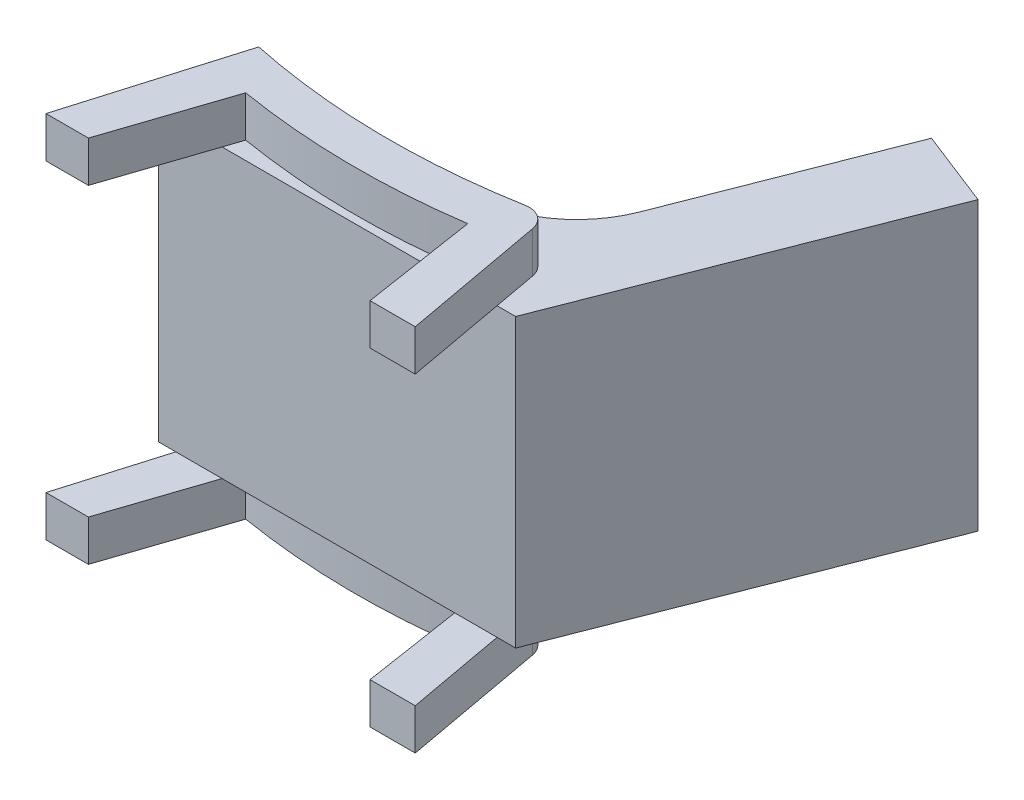
ISO-10303-21;
HEADER;
FILE_DESCRIPTION(('STEP AP214'),'2;1');
FILE_NAME('part.step','',(''),(''),'','','');
FILE_SCHEMA(('AUTOMOTIVE_DESIGN { 1 0 10303 214 1 1 1 1 }'));
ENDSEC;
DATA;
#1=APPLICATION_CONTEXT('core data for automotive mechanical design processes');
#2=APPLICATION_PROTOCOL_DEFINITION('international standard','automotive_design',2000,#1);
#3=PRODUCT_CONTEXT('',#1,'mechanical');
#4=PRODUCT('Part','Part','',(#3));
#5=PRODUCT_RELATED_PRODUCT_CATEGORY('part','',(#4));
#6=PRODUCT_DEFINITION_FORMATION('','',#4);
#7=PRODUCT_DEFINITION_CONTEXT('part definition',#1,'design');
#8=PRODUCT_DEFINITION('design','',#6,#7);
#9=PRODUCT_DEFINITION_SHAPE('','',#8);
#10=(LENGTH_UNIT() NAMED_UNIT(*) SI_UNIT(.MILLI.,.METRE.));
#11=(NAMED_UNIT(*) PLANE_ANGLE_UNIT() SI_UNIT($,.RADIAN.));
#12=(NAMED_UNIT(*) SI_UNIT($,.STERADIAN.) SOLID_ANGLE_UNIT());
#13=UNCERTAINTY_MEASURE_WITH_UNIT(LENGTH_MEASURE(1.E-05),#10,'distance_accuracy_value','');
#14=(GEOMETRIC_REPRESENTATION_CONTEXT(3) GLOBAL_UNCERTAINTY_ASSIGNED_CONTEXT((#13)) GLOBAL_UNIT_ASSIGNED_CONTEXT((#10,
#11,#12)) REPRESENTATION_CONTEXT('',''));
#15=CARTESIAN_POINT('',(0.,0.,0.));
#16=DIRECTION('',(0.,0.,1.));
#17=DIRECTION('',(1.,0.,0.));
#18=AXIS2_PLACEMENT_3D('',#15,#16,#17);
#19=CARTESIAN_POINT('',(0.,0.,0.));
#20=DIRECTION('',(0.,1.,0.));
#21=DIRECTION('',(0.,0.,1.));
#22=AXIS2_PLACEMENT_3D('',#19,#20,#21);
#23=PLANE('',#22);
#24=DIRECTION('',(1.,0.,0.));
#25=VECTOR('',#24,1.);
#26=CARTESIAN_POINT('',(0.,0.,0.));
#27=LINE('',#26,#25);
#28=CARTESIAN_POINT('',(-46.0589342714721,0.,0.));
#29=VERTEX_POINT('',#28);
#30=CARTESIAN_POINT('',(10.6458555513355,0.,0.));
#31=VERTEX_POINT('',#30);
#32=EDGE_CURVE('E570',#29,#31,#27,.T.);
#33=ORIENTED_EDGE('',*,*,#32,.F.);
#34=DIRECTION('',(0.317535573217224,0.,-0.948246360257507));
#35=VECTOR('',#34,1.);
#36=CARTESIAN_POINT('',(-44.613683260958,0.,-4.31590702261566));
#37=LINE('',#36,#35);
#38=CARTESIAN_POINT('',(-44.613683260958,0.,-4.31590702261566));
#39=VERTEX_POINT('',#38);
#40=EDGE_CURVE('E315',#29,#39,#37,.T.);
#41=ORIENTED_EDGE('',*,*,#40,.T.);
#42=CARTESIAN_POINT('',(-15.4614294836007,0.,-180.10475201362));
#43=DIRECTION('',(0.,1.,0.));
#44=DIRECTION('',(0.,0.,1.));
#45=AXIS2_PLACEMENT_3D('',#42,#43,#44);
#46=CIRCLE('',#45,178.189707681367);
#47=CARTESIAN_POINT('',(10.0657857926259,0.,-3.75302051145421));
#48=VERTEX_POINT('',#47);
#49=EDGE_CURVE('E308',#39,#48,#46,.T.);
#50=ORIENTED_EDGE('',*,*,#49,.T.);
#51=DIRECTION('',(0.152747053337756,0.,0.988265317461173));
#52=VECTOR('',#51,1.);
#53=CARTESIAN_POINT('',(10.0657857926259,0.,-3.75302051145418));
#54=LINE('',#53,#52);
#55=EDGE_CURVE('E304',#48,#31,#54,.T.);
#56=ORIENTED_EDGE('',*,*,#55,.T.);
#57=EDGE_LOOP('',(#33,#41,#50,#56));
#58=FACE_BOUND('',#57,.T.);
#59=ADVANCED_FACE('F41',(#58),#23,.F.);
#60=CARTESIAN_POINT('',(0.,70.,0.));
#61=DIRECTION('',(0.,1.,0.));
#62=DIRECTION('',(0.,0.,1.));
#63=AXIS2_PLACEMENT_3D('',#60,#61,#62);
#64=PLANE('',#63);
#65=DIRECTION('',(-0.284095010499683,0.,0.95879613318431));
#66=VECTOR('',#65,1.);
#67=CARTESIAN_POINT('',(-52.712841502614,70.,-15.5886534019939));
#68=LINE('',#67,#66);
#69=CARTESIAN_POINT('',(-52.7128415026139,70.,-15.5886534019939));
#70=VERTEX_POINT('',#69);
#71=CARTESIAN_POINT('',(-57.3318199263244,70.,0.));
#72=VERTEX_POINT('',#71);
#73=EDGE_CURVE('E338',#70,#72,#68,.T.);
#74=ORIENTED_EDGE('',*,*,#73,.F.);
#75=CARTESIAN_POINT('',(-17.2956694732917,70.,-184.924485184418));
#76=DIRECTION('',(0.,-1.,0.));
#77=DIRECTION('',(0.,0.,1.));
#78=AXIS2_PLACEMENT_3D('',#75,#76,#77);
#79=CIRCLE('',#78,173.);
#80=CARTESIAN_POINT('',(13.2298747218645,70.,-14.6388687877604));
#81=VERTEX_POINT('',#80);
#82=EDGE_CURVE('E385',#81,#70,#79,.T.);
#83=ORIENTED_EDGE('',*,*,#82,.F.);
#84=CARTESIAN_POINT('',(14.1121158835742,70.,-9.71731918092061));
#85=DIRECTION('',(0.,1.,0.));
#86=DIRECTION('',(0.,0.,1.));
#87=AXIS2_PLACEMENT_3D('',#84,#85,#86);
#88=CIRCLE('',#87,5.);
#89=CARTESIAN_POINT('',(19.0305806480095,70.,-10.6165990934108));
#90=VERTEX_POINT('',#89);
#91=EDGE_CURVE('E509',#81,#90,#88,.F.);
#92=ORIENTED_EDGE('',*,*,#91,.T.);
#93=DIRECTION('',(-0.179855982498028,0.,-0.983692952887063));
#94=VECTOR('',#93,1.);
#95=CARTESIAN_POINT('',(18.1215025560305,70.,-15.5886534019939));
#96=LINE('',#95,#94);
#97=CARTESIAN_POINT('',(20.9716933246114,70.,0.));
#98=VERTEX_POINT('',#97);
#99=EDGE_CURVE('E386',#98,#90,#96,.T.);
#100=ORIENTED_EDGE('',*,*,#99,.F.);
#101=DIRECTION('',(1.,0.,0.));
#102=VECTOR('',#101,1.);
#103=CARTESIAN_POINT('',(0.,70.,0.));
#104=LINE('',#103,#102);
#105=CARTESIAN_POINT('',(25.4998700607755,70.,0.));
#106=VERTEX_POINT('',#105);
#107=EDGE_CURVE('E437',#98,#106,#104,.T.);
#108=ORIENTED_EDGE('',*,*,#107,.T.);
#109=DIRECTION('',(0.364080080432998,0.,-0.931367647619296));
#110=VECTOR('',#109,1.);
#111=CARTESIAN_POINT('',(22.1197525080925,70.,8.64681234407255));
#112=LINE('',#111,#110);
#113=CARTESIAN_POINT('',(57.1748370584463,70.,-81.0289853428788));
#114=VERTEX_POINT('',#113);
#115=EDGE_CURVE('E442',#106,#114,#112,.T.);
#116=ORIENTED_EDGE('',*,*,#115,.T.);
#117=DIRECTION('',(-0.931367647619296,0.,-0.364080080432998));
#118=VECTOR('',#117,1.);
#119=CARTESIAN_POINT('',(35.0550845503538,70.,-89.6757976869513));
#120=LINE('',#119,#118);
#121=CARTESIAN_POINT('',(38.5474841060604,70.,-88.3105869515387));
#122=VERTEX_POINT('',#121);
#123=EDGE_CURVE('E446',#114,#122,#120,.T.);
#124=ORIENTED_EDGE('',*,*,#123,.T.);
#125=DIRECTION('',(0.364080080432998,0.,-0.931367647619296));
#126=VECTOR('',#125,1.);
#127=CARTESIAN_POINT('',(3.4923995557066,70.,1.36521073541258));
#128=LINE('',#127,#126);
#129=CARTESIAN_POINT('',(18.5561003578887,70.,-37.1698378283091));
#130=VERTEX_POINT('',#129);
#131=EDGE_CURVE('E421',#130,#122,#128,.T.);
#132=ORIENTED_EDGE('',*,*,#131,.F.);
#133=CARTESIAN_POINT('',(-6.59082612783227,70.,-47.));
#134=DIRECTION('',(0.,1.,0.));
#135=DIRECTION('',(0.,0.,1.));
#136=AXIS2_PLACEMENT_3D('',#133,#134,#135);
#137=CIRCLE('',#136,27.);
#138=CARTESIAN_POINT('',(-6.59082612783227,70.,-20.));
#139=VERTEX_POINT('',#138);
#140=EDGE_CURVE('E425',#130,#139,#137,.F.);
#141=ORIENTED_EDGE('',*,*,#140,.T.);
#142=DIRECTION('',(1.,0.,0.));
#143=VECTOR('',#142,1.);
#144=CARTESIAN_POINT('',(0.,70.,-20.));
#145=LINE('',#144,#143);
#146=CARTESIAN_POINT('',(-61.5001299392245,70.,-20.));
#147=VERTEX_POINT('',#146);
#148=EDGE_CURVE('E429',#147,#139,#145,.T.);
#149=ORIENTED_EDGE('',*,*,#148,.F.);
#150=DIRECTION('',(0.,0.,-1.));
#151=VECTOR('',#150,1.);
#152=CARTESIAN_POINT('',(-61.5001299392245,70.,0.));
#153=LINE('',#152,#151);
#154=CARTESIAN_POINT('',(-61.5001299392245,70.,0.));
#155=VERTEX_POINT('',#154);
#156=EDGE_CURVE('E433',#155,#147,#153,.T.);
#157=ORIENTED_EDGE('',*,*,#156,.F.);
#158=EDGE_CURVE('E438',#155,#72,#104,.T.);
#159=ORIENTED_EDGE('',*,*,#158,.T.);
#160=EDGE_LOOP('',(#74,#83,#92,#100,#108,#116,#124,#132,#141,#149,#157,#159));
#161=FACE_BOUND('',#160,.T.);
#162=ADVANCED_FACE('F535',(#161),#64,.T.);
#163=CARTESIAN_POINT('',(3.4923995557066,70.,1.36521073541258));
#164=DIRECTION('',(-0.931367647619296,0.,-0.364080080432998));
#165=DIRECTION('',(-0.364080080432998,0.,0.931367647619296));
#166=AXIS2_PLACEMENT_3D('',#163,#164,#165);
#167=PLANE('',#166);
#168=DIRECTION('',(0.364080080432998,0.,-0.931367647619296));
#169=VECTOR('',#168,1.);
#170=CARTESIAN_POINT('',(3.4923995557066,0.,1.36521073541258));
#171=LINE('',#170,#169);
#172=CARTESIAN_POINT('',(18.5561003578887,0.,-37.1698378283091));
#173=VERTEX_POINT('',#172);
#174=CARTESIAN_POINT('',(38.5474841060604,0.,-88.3105869515387));
#175=VERTEX_POINT('',#174);
#176=EDGE_CURVE('E420',#173,#175,#171,.T.);
#177=ORIENTED_EDGE('',*,*,#176,.F.);
#178=DIRECTION('',(0.,-1.,0.));
#179=VECTOR('',#178,1.);
#180=CARTESIAN_POINT('',(18.5561003578887,70.,-37.1698378283091));
#181=LINE('',#180,#179);
#182=EDGE_CURVE('E496',#130,#173,#181,.T.);
#183=ORIENTED_EDGE('',*,*,#182,.F.);
#184=ORIENTED_EDGE('',*,*,#131,.T.);
#185=DIRECTION('',(0.,-1.,0.));
#186=VECTOR('',#185,1.);
#187=CARTESIAN_POINT('',(38.5474841060604,70.,-88.3105869515387));
#188=LINE('',#187,#186);
#189=EDGE_CURVE('E449',#122,#175,#188,.T.);
#190=ORIENTED_EDGE('',*,*,#189,.T.);
#191=EDGE_LOOP('',(#177,#183,#184,#190));
#192=FACE_BOUND('',#191,.T.);
#193=ADVANCED_FACE('F542',(#192),#167,.T.);
#194=CARTESIAN_POINT('',(-6.59082612783227,70.,-47.));
#195=DIRECTION('',(0.,-1.,0.));
#196=DIRECTION('',(0.,0.,-1.));
#197=AXIS2_PLACEMENT_3D('',#194,#195,#196);
#198=CYLINDRICAL_SURFACE('',#197,27.);
#199=CARTESIAN_POINT('',(-6.59082612783227,0.,-47.));
#200=DIRECTION('',(0.,1.,0.));
#201=DIRECTION('',(0.,0.,1.));
#202=AXIS2_PLACEMENT_3D('',#199,#200,#201);
#203=CIRCLE('',#202,27.);
#204=CARTESIAN_POINT('',(-6.59082612783227,0.,-20.));
#205=VERTEX_POINT('',#204);
#206=EDGE_CURVE('E453',#173,#205,#203,.F.);
#207=ORIENTED_EDGE('',*,*,#206,.T.);
#208=DIRECTION('',(0.,-1.,0.));
#209=VECTOR('',#208,1.);
#210=CARTESIAN_POINT('',(-6.59082612783227,70.,-20.));
#211=LINE('',#210,#209);
#212=EDGE_CURVE('E493',#139,#205,#211,.T.);
#213=ORIENTED_EDGE('',*,*,#212,.F.);
#214=ORIENTED_EDGE('',*,*,#140,.F.);
#215=ORIENTED_EDGE('',*,*,#182,.T.);
#216=EDGE_LOOP('',(#207,#213,#214,#215));
#217=FACE_BOUND('',#216,.T.);
#218=ADVANCED_FACE('F713',(#217),#198,.F.);
#219=CARTESIAN_POINT('',(0.,70.,-20.));
#220=DIRECTION('',(0.,0.,-1.));
#221=DIRECTION('',(-1.,0.,0.));
#222=AXIS2_PLACEMENT_3D('',#219,#220,#221);
#223=PLANE('',#222);
#224=DIRECTION('',(1.,0.,0.));
#225=VECTOR('',#224,1.);
#226=CARTESIAN_POINT('',(0.,0.,-20.));
#227=LINE('',#226,#225);
#228=CARTESIAN_POINT('',(-61.5001299392245,0.,-20.));
#229=VERTEX_POINT('',#228);
#230=EDGE_CURVE('E457',#229,#205,#227,.T.);
#231=ORIENTED_EDGE('',*,*,#230,.F.);
#232=DIRECTION('',(0.,-1.,0.));
#233=VECTOR('',#232,1.);
#234=CARTESIAN_POINT('',(-61.5001299392245,70.,-20.));
#235=LINE('',#234,#233);
#236=EDGE_CURVE('E490',#147,#229,#235,.T.);
#237=ORIENTED_EDGE('',*,*,#236,.F.);
#238=ORIENTED_EDGE('',*,*,#148,.T.);
#239=ORIENTED_EDGE('',*,*,#212,.T.);
#240=EDGE_LOOP('',(#231,#237,#238,#239));
#241=FACE_BOUND('',#240,.T.);
#242=ADVANCED_FACE('F716',(#241),#223,.T.);
#243=CARTESIAN_POINT('',(-61.5001299392245,70.,0.));
#244=DIRECTION('',(-1.,0.,0.));
#245=DIRECTION('',(0.,0.,1.));
#246=AXIS2_PLACEMENT_3D('',#243,#244,#245);
#247=PLANE('',#246);
#248=DIRECTION('',(0.,0.,-1.));
#249=VECTOR('',#248,1.);
#250=CARTESIAN_POINT('',(-61.5001299392245,0.,0.));
#251=LINE('',#250,#249);
#252=CARTESIAN_POINT('',(-61.5001299392245,0.,0.));
#253=VERTEX_POINT('',#252);
#254=EDGE_CURVE('E461',#253,#229,#251,.T.);
#255=ORIENTED_EDGE('',*,*,#254,.F.);
#256=DIRECTION('',(0.,-1.,0.));
#257=VECTOR('',#256,1.);
#258=CARTESIAN_POINT('',(-61.5001299392245,70.,0.));
#259=LINE('',#258,#257);
#260=EDGE_CURVE('E487',#155,#253,#259,.T.);
#261=ORIENTED_EDGE('',*,*,#260,.F.);
#262=ORIENTED_EDGE('',*,*,#156,.T.);
#263=ORIENTED_EDGE('',*,*,#236,.T.);
#264=EDGE_LOOP('',(#255,#261,#262,#263));
#265=FACE_BOUND('',#264,.T.);
#266=ADVANCED_FACE('F718',(#265),#247,.T.);
#267=CARTESIAN_POINT('',(0.,70.,0.));
#268=DIRECTION('',(0.,0.,-1.));
#269=DIRECTION('',(-1.,0.,0.));
#270=AXIS2_PLACEMENT_3D('',#267,#268,#269);
#271=PLANE('',#270);
#272=CARTESIAN_POINT('',(-57.3318199263244,0.,0.));
#273=VERTEX_POINT('',#272);
#274=EDGE_CURVE('E466',#253,#273,#27,.T.);
#275=ORIENTED_EDGE('',*,*,#274,.T.);
#276=EDGE_CURVE('E471',#273,#29,#27,.T.);
#277=ORIENTED_EDGE('',*,*,#276,.T.);
#278=ORIENTED_EDGE('',*,*,#32,.T.);
#279=CARTESIAN_POINT('',(20.9716933246114,0.,0.));
#280=VERTEX_POINT('',#279);
#281=EDGE_CURVE('E566',#31,#280,#27,.T.);
#282=ORIENTED_EDGE('',*,*,#281,.T.);
#283=CARTESIAN_POINT('',(25.4998700607755,0.,0.));
#284=VERTEX_POINT('',#283);
#285=EDGE_CURVE('E465',#280,#284,#27,.T.);
#286=ORIENTED_EDGE('',*,*,#285,.T.);
#287=DIRECTION('',(0.,-1.,0.));
#288=VECTOR('',#287,1.);
#289=CARTESIAN_POINT('',(25.4998700607755,70.,0.));
#290=LINE('',#289,#288);
#291=EDGE_CURVE('E483',#106,#284,#290,.T.);
#292=ORIENTED_EDGE('',*,*,#291,.F.);
#293=ORIENTED_EDGE('',*,*,#107,.F.);
#294=CARTESIAN_POINT('',(10.6458555513355,70.,0.));
#295=VERTEX_POINT('',#294);
#296=EDGE_CURVE('E680',#295,#98,#104,.T.);
#297=ORIENTED_EDGE('',*,*,#296,.F.);
#298=CARTESIAN_POINT('',(-46.0589342714721,70.,0.));
#299=VERTEX_POINT('',#298);
#300=EDGE_CURVE('E693',#299,#295,#104,.T.);
#301=ORIENTED_EDGE('',*,*,#300,.F.);
#302=EDGE_CURVE('E443',#72,#299,#104,.T.);
#303=ORIENTED_EDGE('',*,*,#302,.F.);
#304=ORIENTED_EDGE('',*,*,#158,.F.);
#305=ORIENTED_EDGE('',*,*,#260,.T.);
#306=EDGE_LOOP('',(#275,#277,#278,#282,#286,#292,#293,#297,#301,#303,#304,#305));
#307=FACE_BOUND('',#306,.T.);
#308=ADVANCED_FACE('F568',(#307),#271,.F.);
#309=CARTESIAN_POINT('',(22.1197525080925,70.,8.64681234407255));
#310=DIRECTION('',(-0.931367647619296,0.,-0.364080080432998));
#311=DIRECTION('',(-0.364080080432998,0.,0.931367647619296));
#312=AXIS2_PLACEMENT_3D('',#309,#310,#311);
#313=PLANE('',#312);
#314=DIRECTION('',(0.364080080432998,0.,-0.931367647619296));
#315=VECTOR('',#314,1.);
#316=CARTESIAN_POINT('',(22.1197525080925,0.,8.64681234407255));
#317=LINE('',#316,#315);
#318=CARTESIAN_POINT('',(57.1748370584463,0.,-81.0289853428788));
#319=VERTEX_POINT('',#318);
#320=EDGE_CURVE('E470',#284,#319,#317,.T.);
#321=ORIENTED_EDGE('',*,*,#320,.T.);
#322=DIRECTION('',(0.,-1.,0.));
#323=VECTOR('',#322,1.);
#324=CARTESIAN_POINT('',(57.1748370584463,70.,-81.0289853428788));
#325=LINE('',#324,#323);
#326=EDGE_CURVE('E479',#114,#319,#325,.T.);
#327=ORIENTED_EDGE('',*,*,#326,.F.);
#328=ORIENTED_EDGE('',*,*,#115,.F.);
#329=ORIENTED_EDGE('',*,*,#291,.T.);
#330=EDGE_LOOP('',(#321,#327,#328,#329));
#331=FACE_BOUND('',#330,.T.);
#332=ADVANCED_FACE('F702',(#331),#313,.F.);
#333=CARTESIAN_POINT('',(35.0550845503538,70.,-89.6757976869513));
#334=DIRECTION('',(-0.364080080432998,0.,0.931367647619296));
#335=DIRECTION('',(0.931367647619296,0.,0.364080080432998));
#336=AXIS2_PLACEMENT_3D('',#333,#334,#335);
#337=PLANE('',#336);
#338=DIRECTION('',(-0.931367647619296,0.,-0.364080080432998));
#339=VECTOR('',#338,1.);
#340=CARTESIAN_POINT('',(35.0550845503538,0.,-89.6757976869513));
#341=LINE('',#340,#339);
#342=EDGE_CURVE('E426',#319,#175,#341,.T.);
#343=ORIENTED_EDGE('',*,*,#342,.T.);
#344=ORIENTED_EDGE('',*,*,#189,.F.);
#345=ORIENTED_EDGE('',*,*,#123,.F.);
#346=ORIENTED_EDGE('',*,*,#326,.T.);
#347=EDGE_LOOP('',(#343,#344,#345,#346));
#348=FACE_BOUND('',#347,.T.);
#349=ADVANCED_FACE('F557',(#348),#337,.F.);
#350=DIRECTION('',(0.152747053337756,0.,0.988265317461173));
#351=VECTOR('',#350,1.);
#352=CARTESIAN_POINT('',(10.0657857926259,70.,-3.75302051145418));
#353=LINE('',#352,#351);
#354=CARTESIAN_POINT('',(10.0657857926259,70.,-3.75302051145421));
#355=VERTEX_POINT('',#354);
#356=EDGE_CURVE('E374',#355,#295,#353,.T.);
#357=ORIENTED_EDGE('',*,*,#356,.F.);
#358=CARTESIAN_POINT('',(-15.4614294836007,70.,-180.10475201362));
#359=DIRECTION('',(0.,1.,0.));
#360=DIRECTION('',(0.,0.,1.));
#361=AXIS2_PLACEMENT_3D('',#358,#359,#360);
#362=CIRCLE('',#361,178.189707681367);
#363=CARTESIAN_POINT('',(-44.613683260958,70.,-4.31590702261566));
#364=VERTEX_POINT('',#363);
#365=EDGE_CURVE('E368',#364,#355,#362,.T.);
#366=ORIENTED_EDGE('',*,*,#365,.F.);
#367=DIRECTION('',(0.317535573217224,0.,-0.948246360257507));
#368=VECTOR('',#367,1.);
#369=CARTESIAN_POINT('',(-44.613683260958,70.,-4.31590702261566));
#370=LINE('',#369,#368);
#371=EDGE_CURVE('E369',#299,#364,#370,.T.);
#372=ORIENTED_EDGE('',*,*,#371,.F.);
#373=ORIENTED_EDGE('',*,*,#300,.T.);
#374=EDGE_LOOP('',(#357,#366,#372,#373));
#375=FACE_BOUND('',#374,.T.);
#376=ADVANCED_FACE('F545',(#375),#64,.T.);
#377=ORIENTED_EDGE('',*,*,#285,.F.);
#378=DIRECTION('',(-0.179855982498028,0.,-0.983692952887063));
#379=VECTOR('',#378,1.);
#380=CARTESIAN_POINT('',(18.1215025560305,0.,-15.5886534019939));
#381=LINE('',#380,#379);
#382=CARTESIAN_POINT('',(19.0305806480095,0.,-10.6165990934108));
#383=VERTEX_POINT('',#382);
#384=EDGE_CURVE('E299',#280,#383,#381,.T.);
#385=ORIENTED_EDGE('',*,*,#384,.T.);
#386=CARTESIAN_POINT('',(14.1121158835742,0.,-9.71731918092061));
#387=DIRECTION('',(0.,1.,0.));
#388=DIRECTION('',(0.,0.,1.));
#389=AXIS2_PLACEMENT_3D('',#386,#387,#388);
#390=CIRCLE('',#389,5.);
#391=CARTESIAN_POINT('',(13.2298747218645,0.,-14.6388687877604));
#392=VERTEX_POINT('',#391);
#393=EDGE_CURVE('E11',#383,#392,#390,.T.);
#394=ORIENTED_EDGE('',*,*,#393,.T.);
#395=CARTESIAN_POINT('',(-17.2956694732917,0.,-184.924485184418));
#396=DIRECTION('',(0.,-1.,0.));
#397=DIRECTION('',(0.,0.,1.));
#398=AXIS2_PLACEMENT_3D('',#395,#396,#397);
#399=CIRCLE('',#398,173.);
#400=CARTESIAN_POINT('',(-52.7128415026139,0.,-15.5886534019939));
#401=VERTEX_POINT('',#400);
#402=EDGE_CURVE('E291',#392,#401,#399,.T.);
#403=ORIENTED_EDGE('',*,*,#402,.T.);
#404=DIRECTION('',(-0.284095010499683,0.,0.95879613318431));
#405=VECTOR('',#404,1.);
#406=CARTESIAN_POINT('',(-52.712841502614,0.,-15.5886534019939));
#407=LINE('',#406,#405);
#408=EDGE_CURVE('E287',#401,#273,#407,.T.);
#409=ORIENTED_EDGE('',*,*,#408,.T.);
#410=ORIENTED_EDGE('',*,*,#274,.F.);
#411=ORIENTED_EDGE('',*,*,#254,.T.);
#412=ORIENTED_EDGE('',*,*,#230,.T.);
#413=ORIENTED_EDGE('',*,*,#206,.F.);
#414=ORIENTED_EDGE('',*,*,#176,.T.);
#415=ORIENTED_EDGE('',*,*,#342,.F.);
#416=ORIENTED_EDGE('',*,*,#320,.F.);
#417=EDGE_LOOP('',(#377,#385,#394,#403,#409,#410,#411,#412,#413,#414,#415,#416));
#418=FACE_BOUND('',#417,.T.);
#419=ADVANCED_FACE('F538',(#418),#23,.F.);
#420=CARTESIAN_POINT('',(-15.4614294836007,70.,-180.10475201362));
#421=DIRECTION('',(0.,1.,0.));
#422=DIRECTION('',(0.,0.,1.));
#423=AXIS2_PLACEMENT_3D('',#420,#421,#422);
#424=PLANE('',#423);
#425=CARTESIAN_POINT('',(-64.564996540251,70.,24.4113465980061));
#426=VERTEX_POINT('',#425);
#427=EDGE_CURVE('E389',#72,#426,#68,.T.);
#428=ORIENTED_EDGE('',*,*,#427,.F.);
#429=ORIENTED_EDGE('',*,*,#302,.T.);
#430=CARTESIAN_POINT('',(-54.2334670299181,70.,24.4113465980061));
#431=VERTEX_POINT('',#430);
#432=EDGE_CURVE('E364',#431,#299,#370,.T.);
#433=ORIENTED_EDGE('',*,*,#432,.F.);
#434=DIRECTION('',(1.,0.,0.));
#435=VECTOR('',#434,1.);
#436=CARTESIAN_POINT('',(-64.564996540251,70.,24.4113465980061));
#437=LINE('',#436,#435);
#438=EDGE_CURVE('E242',#426,#431,#437,.T.);
#439=ORIENTED_EDGE('',*,*,#438,.F.);
#440=EDGE_LOOP('',(#428,#429,#433,#439));
#441=FACE_BOUND('',#440,.T.);
#442=ADVANCED_FACE('F549',(#441),#424,.F.);
#443=CARTESIAN_POINT('',(14.4188921994607,70.,24.4113465980061));
#444=VERTEX_POINT('',#443);
#445=EDGE_CURVE('E373',#295,#444,#353,.T.);
#446=ORIENTED_EDGE('',*,*,#445,.F.);
#447=ORIENTED_EDGE('',*,*,#296,.T.);
#448=CARTESIAN_POINT('',(25.435003459749,70.,24.4113465980061));
#449=VERTEX_POINT('',#448);
#450=EDGE_CURVE('E381',#449,#98,#96,.T.);
#451=ORIENTED_EDGE('',*,*,#450,.F.);
#452=DIRECTION('',(1.,0.,0.));
#453=VECTOR('',#452,1.);
#454=CARTESIAN_POINT('',(14.4188921994607,70.,24.4113465980061));
#455=LINE('',#454,#453);
#456=EDGE_CURVE('E378',#444,#449,#455,.T.);
#457=ORIENTED_EDGE('',*,*,#456,.F.);
#458=EDGE_LOOP('',(#446,#447,#451,#457));
#459=FACE_BOUND('',#458,.T.);
#460=ADVANCED_FACE('F554',(#459),#424,.F.);
#461=CARTESIAN_POINT('',(-64.564996540251,80.,24.4113465980061));
#462=DIRECTION('',(0.,0.,-1.));
#463=DIRECTION('',(-1.,0.,0.));
#464=AXIS2_PLACEMENT_3D('',#461,#462,#463);
#465=PLANE('',#464);
#466=ORIENTED_EDGE('',*,*,#438,.T.);
#467=DIRECTION('',(0.,-1.,0.));
#468=VECTOR('',#467,1.);
#469=CARTESIAN_POINT('',(-54.2334670299181,80.,24.4113465980061));
#470=LINE('',#469,#468);
#471=CARTESIAN_POINT('',(-54.2334670299181,80.,24.4113465980061));
#472=VERTEX_POINT('',#471);
#473=EDGE_CURVE('E416',#472,#431,#470,.T.);
#474=ORIENTED_EDGE('',*,*,#473,.F.);
#475=DIRECTION('',(1.,0.,0.));
#476=VECTOR('',#475,1.);
#477=CARTESIAN_POINT('',(-64.564996540251,80.,24.4113465980061));
#478=LINE('',#477,#476);
#479=CARTESIAN_POINT('',(-64.564996540251,80.,24.4113465980061));
#480=VERTEX_POINT('',#479);
#481=EDGE_CURVE('E333',#480,#472,#478,.T.);
#482=ORIENTED_EDGE('',*,*,#481,.F.);
#483=DIRECTION('',(0.,-1.,0.));
#484=VECTOR('',#483,1.);
#485=CARTESIAN_POINT('',(-64.564996540251,80.,24.4113465980061));
#486=LINE('',#485,#484);
#487=EDGE_CURVE('E360',#480,#426,#486,.T.);
#488=ORIENTED_EDGE('',*,*,#487,.T.);
#489=EDGE_LOOP('',(#466,#474,#482,#488));
#490=FACE_BOUND('',#489,.T.);
#491=ADVANCED_FACE('F649',(#490),#465,.F.);
#492=CARTESIAN_POINT('',(-44.613683260958,80.,-4.31590702261566));
#493=DIRECTION('',(-0.948246360257507,0.,-0.317535573217224));
#494=DIRECTION('',(-0.317535573217224,0.,0.948246360257507));
#495=AXIS2_PLACEMENT_3D('',#492,#493,#494);
#496=PLANE('',#495);
#497=ORIENTED_EDGE('',*,*,#432,.T.);
#498=ORIENTED_EDGE('',*,*,#371,.T.);
#499=DIRECTION('',(0.,-1.,0.));
#500=VECTOR('',#499,1.);
#501=CARTESIAN_POINT('',(-44.613683260958,80.,-4.31590702261566));
#502=LINE('',#501,#500);
#503=CARTESIAN_POINT('',(-44.613683260958,80.,-4.31590702261566));
#504=VERTEX_POINT('',#503);
#505=EDGE_CURVE('E412',#504,#364,#502,.T.);
#506=ORIENTED_EDGE('',*,*,#505,.F.);
#507=DIRECTION('',(0.317535573217224,0.,-0.948246360257507));
#508=VECTOR('',#507,1.);
#509=CARTESIAN_POINT('',(-44.613683260958,80.,-4.31590702261566));
#510=LINE('',#509,#508);
#511=EDGE_CURVE('E337',#472,#504,#510,.T.);
#512=ORIENTED_EDGE('',*,*,#511,.F.);
#513=ORIENTED_EDGE('',*,*,#473,.T.);
#514=EDGE_LOOP('',(#497,#498,#506,#512,#513));
#515=FACE_BOUND('',#514,.T.);
#516=ADVANCED_FACE('F645',(#515),#496,.F.);
#517=CARTESIAN_POINT('',(-15.4614294836007,80.,-180.10475201362));
#518=DIRECTION('',(0.,-1.,0.));
#519=DIRECTION('',(0.,0.,-1.));
#520=AXIS2_PLACEMENT_3D('',#517,#518,#519);
#521=CYLINDRICAL_SURFACE('',#520,178.189707681367);
#522=ORIENTED_EDGE('',*,*,#365,.T.);
#523=DIRECTION('',(0.,-1.,0.));
#524=VECTOR('',#523,1.);
#525=CARTESIAN_POINT('',(10.0657857926259,80.,-3.75302051145421));
#526=LINE('',#525,#524);
#527=CARTESIAN_POINT('',(10.0657857926259,80.,-3.75302051145421));
#528=VERTEX_POINT('',#527);
#529=EDGE_CURVE('E408',#528,#355,#526,.T.);
#530=ORIENTED_EDGE('',*,*,#529,.F.);
#531=CARTESIAN_POINT('',(-15.4614294836007,80.,-180.10475201362));
#532=DIRECTION('',(0.,1.,0.));
#533=DIRECTION('',(0.,0.,1.));
#534=AXIS2_PLACEMENT_3D('',#531,#532,#533);
#535=CIRCLE('',#534,178.189707681367);
#536=EDGE_CURVE('E341',#504,#528,#535,.T.);
#537=ORIENTED_EDGE('',*,*,#536,.F.);
#538=ORIENTED_EDGE('',*,*,#505,.T.);
#539=EDGE_LOOP('',(#522,#530,#537,#538));
#540=FACE_BOUND('',#539,.T.);
#541=ADVANCED_FACE('F641',(#540),#521,.T.);
#542=CARTESIAN_POINT('',(10.0657857926259,80.,-3.75302051145418));
#543=DIRECTION('',(0.988265317461173,0.,-0.152747053337756));
#544=DIRECTION('',(-0.152747053337756,0.,-0.988265317461173));
#545=AXIS2_PLACEMENT_3D('',#542,#543,#544);
#546=PLANE('',#545);
#547=ORIENTED_EDGE('',*,*,#356,.T.);
#548=ORIENTED_EDGE('',*,*,#445,.T.);
#549=DIRECTION('',(0.,-1.,0.));
#550=VECTOR('',#549,1.);
#551=CARTESIAN_POINT('',(14.4188921994607,80.,24.4113465980061));
#552=LINE('',#551,#550);
#553=CARTESIAN_POINT('',(14.4188921994607,80.,24.4113465980061));
#554=VERTEX_POINT('',#553);
#555=EDGE_CURVE('E404',#554,#444,#552,.T.);
#556=ORIENTED_EDGE('',*,*,#555,.F.);
#557=DIRECTION('',(0.152747053337756,0.,0.988265317461173));
#558=VECTOR('',#557,1.);
#559=CARTESIAN_POINT('',(10.0657857926259,80.,-3.75302051145418));
#560=LINE('',#559,#558);
#561=EDGE_CURVE('E344',#528,#554,#560,.T.);
#562=ORIENTED_EDGE('',*,*,#561,.F.);
#563=ORIENTED_EDGE('',*,*,#529,.T.);
#564=EDGE_LOOP('',(#547,#548,#556,#562,#563));
#565=FACE_BOUND('',#564,.T.);
#566=ADVANCED_FACE('F637',(#565),#546,.F.);
#567=CARTESIAN_POINT('',(14.4188921994607,80.,24.4113465980061));
#568=DIRECTION('',(0.,0.,-1.));
#569=DIRECTION('',(-1.,0.,0.));
#570=AXIS2_PLACEMENT_3D('',#567,#568,#569);
#571=PLANE('',#570);
#572=ORIENTED_EDGE('',*,*,#456,.T.);
#573=DIRECTION('',(0.,-1.,0.));
#574=VECTOR('',#573,1.);
#575=CARTESIAN_POINT('',(25.435003459749,80.,24.4113465980061));
#576=LINE('',#575,#574);
#577=CARTESIAN_POINT('',(25.435003459749,80.,24.4113465980061));
#578=VERTEX_POINT('',#577);
#579=EDGE_CURVE('E400',#578,#449,#576,.T.);
#580=ORIENTED_EDGE('',*,*,#579,.F.);
#581=DIRECTION('',(1.,0.,0.));
#582=VECTOR('',#581,1.);
#583=CARTESIAN_POINT('',(14.4188921994607,80.,24.4113465980061));
#584=LINE('',#583,#582);
#585=EDGE_CURVE('E347',#554,#578,#584,.T.);
#586=ORIENTED_EDGE('',*,*,#585,.F.);
#587=ORIENTED_EDGE('',*,*,#555,.T.);
#588=EDGE_LOOP('',(#572,#580,#586,#587));
#589=FACE_BOUND('',#588,.T.);
#590=ADVANCED_FACE('F633',(#589),#571,.F.);
#591=CARTESIAN_POINT('',(18.1215025560305,80.,-15.5886534019939));
#592=DIRECTION('',(-0.983692952887063,0.,0.179855982498028));
#593=DIRECTION('',(0.179855982498028,0.,0.983692952887063));
#594=AXIS2_PLACEMENT_3D('',#591,#592,#593);
#595=PLANE('',#594);
#596=ORIENTED_EDGE('',*,*,#99,.T.);
#597=DIRECTION('',(0.,-1.,0.));
#598=VECTOR('',#597,1.);
#599=CARTESIAN_POINT('',(19.0305806480095,80.,-10.6165990934108));
#600=LINE('',#599,#598);
#601=CARTESIAN_POINT('',(19.0305806480095,80.,-10.6165990934108));
#602=VERTEX_POINT('',#601);
#603=EDGE_CURVE('E503',#90,#602,#600,.F.);
#604=ORIENTED_EDGE('',*,*,#603,.T.);
#605=DIRECTION('',(-0.179855982498028,0.,-0.983692952887063));
#606=VECTOR('',#605,1.);
#607=CARTESIAN_POINT('',(18.1215025560305,80.,-15.5886534019939));
#608=LINE('',#607,#606);
#609=EDGE_CURVE('E350',#578,#602,#608,.T.);
#610=ORIENTED_EDGE('',*,*,#609,.F.);
#611=ORIENTED_EDGE('',*,*,#579,.T.);
#612=ORIENTED_EDGE('',*,*,#450,.T.);
#613=EDGE_LOOP('',(#596,#604,#610,#611,#612));
#614=FACE_BOUND('',#613,.T.);
#615=ADVANCED_FACE('F629',(#614),#595,.F.);
#616=CARTESIAN_POINT('',(-17.2956694732917,80.,-184.924485184418));
#617=DIRECTION('',(0.,-1.,0.));
#618=DIRECTION('',(0.,0.,-1.));
#619=AXIS2_PLACEMENT_3D('',#616,#617,#618);
#620=CYLINDRICAL_SURFACE('',#619,173.);
#621=CARTESIAN_POINT('',(-17.2956694732917,80.,-184.924485184418));
#622=DIRECTION('',(0.,-1.,0.));
#623=DIRECTION('',(0.,0.,1.));
#624=AXIS2_PLACEMENT_3D('',#621,#622,#623);
#625=CIRCLE('',#624,173.);
#626=CARTESIAN_POINT('',(13.2298747218645,80.,-14.6388687877604));
#627=VERTEX_POINT('',#626);
#628=CARTESIAN_POINT('',(-52.7128415026139,80.,-15.5886534019939));
#629=VERTEX_POINT('',#628);
#630=EDGE_CURVE('E354',#627,#629,#625,.T.);
#631=ORIENTED_EDGE('',*,*,#630,.F.);
#632=DIRECTION('',(0.,-1.,0.));
#633=VECTOR('',#632,1.);
#634=CARTESIAN_POINT('',(13.2298747218644,80.,-14.6388687877604));
#635=LINE('',#634,#633);
#636=EDGE_CURVE('E499',#627,#81,#635,.T.);
#637=ORIENTED_EDGE('',*,*,#636,.T.);
#638=ORIENTED_EDGE('',*,*,#82,.T.);
#639=DIRECTION('',(0.,-1.,0.));
#640=VECTOR('',#639,1.);
#641=CARTESIAN_POINT('',(-52.7128415026139,80.,-15.5886534019939));
#642=LINE('',#641,#640);
#643=EDGE_CURVE('E396',#629,#70,#642,.T.);
#644=ORIENTED_EDGE('',*,*,#643,.F.);
#645=EDGE_LOOP('',(#631,#637,#638,#644));
#646=FACE_BOUND('',#645,.T.);
#647=ADVANCED_FACE('F625',(#646),#620,.F.);
#648=CARTESIAN_POINT('',(-52.712841502614,80.,-15.5886534019939));
#649=DIRECTION('',(0.95879613318431,0.,0.284095010499683));
#650=DIRECTION('',(0.284095010499683,0.,-0.95879613318431));
#651=AXIS2_PLACEMENT_3D('',#648,#649,#650);
#652=PLANE('',#651);
#653=ORIENTED_EDGE('',*,*,#73,.T.);
#654=ORIENTED_EDGE('',*,*,#427,.T.);
#655=ORIENTED_EDGE('',*,*,#487,.F.);
#656=DIRECTION('',(-0.284095010499683,0.,0.95879613318431));
#657=VECTOR('',#656,1.);
#658=CARTESIAN_POINT('',(-52.712841502614,80.,-15.5886534019939));
#659=LINE('',#658,#657);
#660=EDGE_CURVE('E357',#629,#480,#659,.T.);
#661=ORIENTED_EDGE('',*,*,#660,.F.);
#662=ORIENTED_EDGE('',*,*,#643,.T.);
#663=EDGE_LOOP('',(#653,#654,#655,#661,#662));
#664=FACE_BOUND('',#663,.T.);
#665=ADVANCED_FACE('F620',(#664),#652,.F.);
#666=CARTESIAN_POINT('',(-15.4614294836007,80.,-180.10475201362));
#667=DIRECTION('',(0.,1.,0.));
#668=DIRECTION('',(0.,0.,1.));
#669=AXIS2_PLACEMENT_3D('',#666,#667,#668);
#670=PLANE('',#669);
#671=ORIENTED_EDGE('',*,*,#609,.T.);
#672=CARTESIAN_POINT('',(14.1121158835742,80.,-9.71731918092061));
#673=DIRECTION('',(0.,1.,0.));
#674=DIRECTION('',(0.,0.,1.));
#675=AXIS2_PLACEMENT_3D('',#672,#673,#674);
#676=CIRCLE('',#675,5.);
#677=EDGE_CURVE('E506',#602,#627,#676,.T.);
#678=ORIENTED_EDGE('',*,*,#677,.T.);
#679=ORIENTED_EDGE('',*,*,#630,.T.);
#680=ORIENTED_EDGE('',*,*,#660,.T.);
#681=ORIENTED_EDGE('',*,*,#481,.T.);
#682=ORIENTED_EDGE('',*,*,#511,.T.);
#683=ORIENTED_EDGE('',*,*,#536,.T.);
#684=ORIENTED_EDGE('',*,*,#561,.T.);
#685=ORIENTED_EDGE('',*,*,#585,.T.);
#686=EDGE_LOOP('',(#671,#678,#679,#680,#681,#682,#683,#684,#685));
#687=FACE_BOUND('',#686,.T.);
#688=ADVANCED_FACE('F617',(#687),#670,.T.);
#689=CARTESIAN_POINT('',(14.1121158835742,80.,-9.71731918092061));
#690=DIRECTION('',(0.,-1.,0.));
#691=DIRECTION('',(0.,0.,-1.));
#692=AXIS2_PLACEMENT_3D('',#689,#690,#691);
#693=CYLINDRICAL_SURFACE('',#692,5.);
#694=ORIENTED_EDGE('',*,*,#677,.F.);
#695=ORIENTED_EDGE('',*,*,#603,.F.);
#696=ORIENTED_EDGE('',*,*,#91,.F.);
#697=ORIENTED_EDGE('',*,*,#636,.F.);
#698=EDGE_LOOP('',(#694,#695,#696,#697));
#699=FACE_BOUND('',#698,.T.);
#700=ADVANCED_FACE('F619',(#699),#693,.T.);
#701=CARTESIAN_POINT('',(-15.4614294836007,0.,-180.10475201362));
#702=DIRECTION('',(0.,-1.,0.));
#703=DIRECTION('',(0.,0.,1.));
#704=AXIS2_PLACEMENT_3D('',#701,#702,#703);
#705=PLANE('',#704);
#706=ORIENTED_EDGE('',*,*,#276,.F.);
#707=CARTESIAN_POINT('',(-64.564996540251,0.,24.4113465980061));
#708=VERTEX_POINT('',#707);
#709=EDGE_CURVE('E286',#273,#708,#407,.T.);
#710=ORIENTED_EDGE('',*,*,#709,.T.);
#711=DIRECTION('',(1.,0.,0.));
#712=VECTOR('',#711,1.);
#713=CARTESIAN_POINT('',(-64.564996540251,0.,24.4113465980061));
#714=LINE('',#713,#712);
#715=CARTESIAN_POINT('',(-54.2334670299181,0.,24.4113465980061));
#716=VERTEX_POINT('',#715);
#717=EDGE_CURVE('E238',#708,#716,#714,.T.);
#718=ORIENTED_EDGE('',*,*,#717,.T.);
#719=EDGE_CURVE('E253',#716,#29,#37,.T.);
#720=ORIENTED_EDGE('',*,*,#719,.T.);
#721=EDGE_LOOP('',(#706,#710,#718,#720));
#722=FACE_BOUND('',#721,.T.);
#723=ADVANCED_FACE('F533',(#722),#705,.F.);
#724=CARTESIAN_POINT('',(-64.564996540251,-10.,24.4113465980061));
#725=DIRECTION('',(0.,0.,1.));
#726=DIRECTION('',(1.,0.,0.));
#727=AXIS2_PLACEMENT_3D('',#724,#725,#726);
#728=PLANE('',#727);
#729=ORIENTED_EDGE('',*,*,#717,.F.);
#730=DIRECTION('',(0.,1.,0.));
#731=VECTOR('',#730,1.);
#732=CARTESIAN_POINT('',(-64.564996540251,-10.,24.4113465980061));
#733=LINE('',#732,#731);
#734=CARTESIAN_POINT('',(-64.564996540251,-10.,24.4113465980061));
#735=VERTEX_POINT('',#734);
#736=EDGE_CURVE('E232',#735,#708,#733,.T.);
#737=ORIENTED_EDGE('',*,*,#736,.F.);
#738=DIRECTION('',(1.,0.,0.));
#739=VECTOR('',#738,1.);
#740=CARTESIAN_POINT('',(-64.564996540251,-10.,24.4113465980061));
#741=LINE('',#740,#739);
#742=CARTESIAN_POINT('',(-54.2334670299181,-10.,24.4113465980061));
#743=VERTEX_POINT('',#742);
#744=EDGE_CURVE('E235',#735,#743,#741,.T.);
#745=ORIENTED_EDGE('',*,*,#744,.T.);
#746=DIRECTION('',(0.,1.,0.));
#747=VECTOR('',#746,1.);
#748=CARTESIAN_POINT('',(-54.2334670299181,-10.,24.4113465980061));
#749=LINE('',#748,#747);
#750=EDGE_CURVE('E283',#743,#716,#749,.T.);
#751=ORIENTED_EDGE('',*,*,#750,.T.);
#752=EDGE_LOOP('',(#729,#737,#745,#751));
#753=FACE_BOUND('',#752,.T.);
#754=ADVANCED_FACE('F234',(#753),#728,.T.);
#755=CARTESIAN_POINT('',(-52.712841502614,-10.,-15.5886534019939));
#756=DIRECTION('',(-0.95879613318431,0.,-0.284095010499683));
#757=DIRECTION('',(-0.284095010499683,0.,0.95879613318431));
#758=AXIS2_PLACEMENT_3D('',#755,#756,#757);
#759=PLANE('',#758);
#760=ORIENTED_EDGE('',*,*,#408,.F.);
#761=DIRECTION('',(0.,1.,0.));
#762=VECTOR('',#761,1.);
#763=CARTESIAN_POINT('',(-52.7128415026139,-10.,-15.5886534019939));
#764=LINE('',#763,#762);
#765=CARTESIAN_POINT('',(-52.7128415026139,-10.,-15.5886534019939));
#766=VERTEX_POINT('',#765);
#767=EDGE_CURVE('E243',#766,#401,#764,.T.);
#768=ORIENTED_EDGE('',*,*,#767,.F.);
#769=DIRECTION('',(-0.284095010499683,0.,0.95879613318431));
#770=VECTOR('',#769,1.);
#771=CARTESIAN_POINT('',(-52.712841502614,-10.,-15.5886534019939));
#772=LINE('',#771,#770);
#773=EDGE_CURVE('E248',#766,#735,#772,.T.);
#774=ORIENTED_EDGE('',*,*,#773,.T.);
#775=ORIENTED_EDGE('',*,*,#736,.T.);
#776=ORIENTED_EDGE('',*,*,#709,.F.);
#777=EDGE_LOOP('',(#760,#768,#774,#775,#776));
#778=FACE_BOUND('',#777,.T.);
#779=ADVANCED_FACE('F257',(#778),#759,.T.);
#780=CARTESIAN_POINT('',(-17.2956694732917,-10.,-184.924485184418));
#781=DIRECTION('',(0.,1.,0.));
#782=DIRECTION('',(0.,0.,1.));
#783=AXIS2_PLACEMENT_3D('',#780,#781,#782);
#784=CYLINDRICAL_SURFACE('',#783,173.);
#785=ORIENTED_EDGE('',*,*,#402,.F.);
#786=DIRECTION('',(0.,1.,0.));
#787=VECTOR('',#786,1.);
#788=CARTESIAN_POINT('',(13.2298747218644,-10.,-14.6388687877604));
#789=LINE('',#788,#787);
#790=CARTESIAN_POINT('',(13.2298747218645,-10.,-14.6388687877604));
#791=VERTEX_POINT('',#790);
#792=EDGE_CURVE('E57',#392,#791,#789,.F.);
#793=ORIENTED_EDGE('',*,*,#792,.T.);
#794=CARTESIAN_POINT('',(-17.2956694732917,-10.,-184.924485184418));
#795=DIRECTION('',(0.,-1.,0.));
#796=DIRECTION('',(0.,0.,1.));
#797=AXIS2_PLACEMENT_3D('',#794,#795,#796);
#798=CIRCLE('',#797,173.);
#799=EDGE_CURVE('E260',#791,#766,#798,.T.);
#800=ORIENTED_EDGE('',*,*,#799,.T.);
#801=ORIENTED_EDGE('',*,*,#767,.T.);
#802=EDGE_LOOP('',(#785,#793,#800,#801));
#803=FACE_BOUND('',#802,.T.);
#804=ADVANCED_FACE('F610',(#803),#784,.F.);
#805=CARTESIAN_POINT('',(18.1215025560305,-10.,-15.5886534019939));
#806=DIRECTION('',(0.983692952887063,0.,-0.179855982498028));
#807=DIRECTION('',(-0.179855982498028,0.,-0.983692952887063));
#808=AXIS2_PLACEMENT_3D('',#805,#806,#807);
#809=PLANE('',#808);
#810=DIRECTION('',(-0.179855982498028,0.,-0.983692952887063));
#811=VECTOR('',#810,1.);
#812=CARTESIAN_POINT('',(18.1215025560305,-10.,-15.5886534019939));
#813=LINE('',#812,#811);
#814=CARTESIAN_POINT('',(25.435003459749,-10.,24.4113465980061));
#815=VERTEX_POINT('',#814);
#816=CARTESIAN_POINT('',(19.0305806480095,-10.,-10.6165990934108));
#817=VERTEX_POINT('',#816);
#818=EDGE_CURVE('E263',#815,#817,#813,.T.);
#819=ORIENTED_EDGE('',*,*,#818,.T.);
#820=DIRECTION('',(0.,1.,0.));
#821=VECTOR('',#820,1.);
#822=CARTESIAN_POINT('',(19.0305806480095,-10.,-10.6165990934108));
#823=LINE('',#822,#821);
#824=EDGE_CURVE('E512',#817,#383,#823,.T.);
#825=ORIENTED_EDGE('',*,*,#824,.T.);
#826=ORIENTED_EDGE('',*,*,#384,.F.);
#827=CARTESIAN_POINT('',(25.435003459749,0.,24.4113465980061));
#828=VERTEX_POINT('',#827);
#829=EDGE_CURVE('E294',#828,#280,#381,.T.);
#830=ORIENTED_EDGE('',*,*,#829,.F.);
#831=DIRECTION('',(0.,1.,0.));
#832=VECTOR('',#831,1.);
#833=CARTESIAN_POINT('',(25.435003459749,-10.,24.4113465980061));
#834=LINE('',#833,#832);
#835=EDGE_CURVE('E328',#815,#828,#834,.T.);
#836=ORIENTED_EDGE('',*,*,#835,.F.);
#837=EDGE_LOOP('',(#819,#825,#826,#830,#836));
#838=FACE_BOUND('',#837,.T.);
#839=ADVANCED_FACE('F524',(#838),#809,.T.);
#840=CARTESIAN_POINT('',(14.4188921994607,-10.,24.4113465980061));
#841=DIRECTION('',(0.,0.,1.));
#842=DIRECTION('',(1.,0.,0.));
#843=AXIS2_PLACEMENT_3D('',#840,#841,#842);
#844=PLANE('',#843);
#845=DIRECTION('',(1.,0.,0.));
#846=VECTOR('',#845,1.);
#847=CARTESIAN_POINT('',(14.4188921994607,0.,24.4113465980061));
#848=LINE('',#847,#846);
#849=CARTESIAN_POINT('',(14.4188921994607,0.,24.4113465980061));
#850=VERTEX_POINT('',#849);
#851=EDGE_CURVE('E298',#850,#828,#848,.T.);
#852=ORIENTED_EDGE('',*,*,#851,.F.);
#853=DIRECTION('',(0.,1.,0.));
#854=VECTOR('',#853,1.);
#855=CARTESIAN_POINT('',(14.4188921994607,-10.,24.4113465980061));
#856=LINE('',#855,#854);
#857=CARTESIAN_POINT('',(14.4188921994607,-10.,24.4113465980061));
#858=VERTEX_POINT('',#857);
#859=EDGE_CURVE('E324',#858,#850,#856,.T.);
#860=ORIENTED_EDGE('',*,*,#859,.F.);
#861=DIRECTION('',(1.,0.,0.));
#862=VECTOR('',#861,1.);
#863=CARTESIAN_POINT('',(14.4188921994607,-10.,24.4113465980061));
#864=LINE('',#863,#862);
#865=EDGE_CURVE('E269',#858,#815,#864,.T.);
#866=ORIENTED_EDGE('',*,*,#865,.T.);
#867=ORIENTED_EDGE('',*,*,#835,.T.);
#868=EDGE_LOOP('',(#852,#860,#866,#867));
#869=FACE_BOUND('',#868,.T.);
#870=ADVANCED_FACE('F588',(#869),#844,.T.);
#871=CARTESIAN_POINT('',(10.0657857926259,-10.,-3.75302051145418));
#872=DIRECTION('',(-0.988265317461173,0.,0.152747053337756));
#873=DIRECTION('',(0.152747053337756,0.,0.988265317461173));
#874=AXIS2_PLACEMENT_3D('',#871,#872,#873);
#875=PLANE('',#874);
#876=ORIENTED_EDGE('',*,*,#55,.F.);
#877=DIRECTION('',(0.,1.,0.));
#878=VECTOR('',#877,1.);
#879=CARTESIAN_POINT('',(10.0657857926259,-10.,-3.75302051145421));
#880=LINE('',#879,#878);
#881=CARTESIAN_POINT('',(10.0657857926259,-10.,-3.75302051145421));
#882=VERTEX_POINT('',#881);
#883=EDGE_CURVE('E321',#882,#48,#880,.T.);
#884=ORIENTED_EDGE('',*,*,#883,.F.);
#885=DIRECTION('',(0.152747053337756,0.,0.988265317461173));
#886=VECTOR('',#885,1.);
#887=CARTESIAN_POINT('',(10.0657857926259,-10.,-3.75302051145418));
#888=LINE('',#887,#886);
#889=EDGE_CURVE('E273',#882,#858,#888,.T.);
#890=ORIENTED_EDGE('',*,*,#889,.T.);
#891=ORIENTED_EDGE('',*,*,#859,.T.);
#892=EDGE_CURVE('E303',#31,#850,#54,.T.);
#893=ORIENTED_EDGE('',*,*,#892,.F.);
#894=EDGE_LOOP('',(#876,#884,#890,#891,#893));
#895=FACE_BOUND('',#894,.T.);
#896=ADVANCED_FACE('F585',(#895),#875,.T.);
#897=CARTESIAN_POINT('',(-15.4614294836007,-10.,-180.10475201362));
#898=DIRECTION('',(0.,1.,0.));
#899=DIRECTION('',(0.,0.,1.));
#900=AXIS2_PLACEMENT_3D('',#897,#898,#899);
#901=CYLINDRICAL_SURFACE('',#900,178.189707681367);
#902=ORIENTED_EDGE('',*,*,#49,.F.);
#903=DIRECTION('',(0.,1.,0.));
#904=VECTOR('',#903,1.);
#905=CARTESIAN_POINT('',(-44.613683260958,-10.,-4.31590702261566));
#906=LINE('',#905,#904);
#907=CARTESIAN_POINT('',(-44.613683260958,-10.,-4.31590702261566));
#908=VERTEX_POINT('',#907);
#909=EDGE_CURVE('E318',#908,#39,#906,.T.);
#910=ORIENTED_EDGE('',*,*,#909,.F.);
#911=CARTESIAN_POINT('',(-15.4614294836007,-10.,-180.10475201362));
#912=DIRECTION('',(0.,1.,0.));
#913=DIRECTION('',(0.,0.,1.));
#914=AXIS2_PLACEMENT_3D('',#911,#912,#913);
#915=CIRCLE('',#914,178.189707681367);
#916=EDGE_CURVE('E277',#908,#882,#915,.T.);
#917=ORIENTED_EDGE('',*,*,#916,.T.);
#918=ORIENTED_EDGE('',*,*,#883,.T.);
#919=EDGE_LOOP('',(#902,#910,#917,#918));
#920=FACE_BOUND('',#919,.T.);
#921=ADVANCED_FACE('F596',(#920),#901,.T.);
#922=CARTESIAN_POINT('',(-44.613683260958,-10.,-4.31590702261566));
#923=DIRECTION('',(0.948246360257507,0.,0.317535573217224));
#924=DIRECTION('',(0.317535573217224,0.,-0.948246360257507));
#925=AXIS2_PLACEMENT_3D('',#922,#923,#924);
#926=PLANE('',#925);
#927=ORIENTED_EDGE('',*,*,#719,.F.);
#928=ORIENTED_EDGE('',*,*,#750,.F.);
#929=DIRECTION('',(0.317535573217224,0.,-0.948246360257507));
#930=VECTOR('',#929,1.);
#931=CARTESIAN_POINT('',(-44.613683260958,-10.,-4.31590702261566));
#932=LINE('',#931,#930);
#933=EDGE_CURVE('E251',#743,#908,#932,.T.);
#934=ORIENTED_EDGE('',*,*,#933,.T.);
#935=ORIENTED_EDGE('',*,*,#909,.T.);
#936=ORIENTED_EDGE('',*,*,#40,.F.);
#937=EDGE_LOOP('',(#927,#928,#934,#935,#936));
#938=FACE_BOUND('',#937,.T.);
#939=ADVANCED_FACE('F594',(#938),#926,.T.);
#940=CARTESIAN_POINT('',(-15.4614294836007,-10.,-180.10475201362));
#941=DIRECTION('',(0.,-1.,0.));
#942=DIRECTION('',(0.,0.,1.));
#943=AXIS2_PLACEMENT_3D('',#940,#941,#942);
#944=PLANE('',#943);
#945=ORIENTED_EDGE('',*,*,#799,.F.);
#946=CARTESIAN_POINT('',(14.1121158835742,-10.,-9.71731918092061));
#947=DIRECTION('',(0.,-1.,0.));
#948=DIRECTION('',(0.,0.,-1.));
#949=AXIS2_PLACEMENT_3D('',#946,#947,#948);
#950=CIRCLE('',#949,5.);
#951=EDGE_CURVE('E50',#791,#817,#950,.T.);
#952=ORIENTED_EDGE('',*,*,#951,.T.);
#953=ORIENTED_EDGE('',*,*,#818,.F.);
#954=ORIENTED_EDGE('',*,*,#865,.F.);
#955=ORIENTED_EDGE('',*,*,#889,.F.);
#956=ORIENTED_EDGE('',*,*,#916,.F.);
#957=ORIENTED_EDGE('',*,*,#933,.F.);
#958=ORIENTED_EDGE('',*,*,#744,.F.);
#959=ORIENTED_EDGE('',*,*,#773,.F.);
#960=EDGE_LOOP('',(#945,#952,#953,#954,#955,#956,#957,#958,#959));
#961=FACE_BOUND('',#960,.T.);
#962=ADVANCED_FACE('F247',(#961),#944,.T.);
#963=ORIENTED_EDGE('',*,*,#281,.F.);
#964=ORIENTED_EDGE('',*,*,#892,.T.);
#965=ORIENTED_EDGE('',*,*,#851,.T.);
#966=ORIENTED_EDGE('',*,*,#829,.T.);
#967=EDGE_LOOP('',(#963,#964,#965,#966));
#968=FACE_BOUND('',#967,.T.);
#969=ADVANCED_FACE('F527',(#968),#705,.F.);
#970=CARTESIAN_POINT('',(14.1121158835742,-10.,-9.71731918092061));
#971=DIRECTION('',(0.,1.,0.));
#972=DIRECTION('',(0.,0.,1.));
#973=AXIS2_PLACEMENT_3D('',#970,#971,#972);
#974=CYLINDRICAL_SURFACE('',#973,5.);
#975=ORIENTED_EDGE('',*,*,#951,.F.);
#976=ORIENTED_EDGE('',*,*,#792,.F.);
#977=ORIENTED_EDGE('',*,*,#393,.F.);
#978=ORIENTED_EDGE('',*,*,#824,.F.);
#979=EDGE_LOOP('',(#975,#976,#977,#978));
#980=FACE_BOUND('',#979,.T.);
#981=ADVANCED_FACE('F43',(#980),#974,.T.);
#982=CLOSED_SHELL('',(#59,#162,#193,#218,#242,#266,#308,#332,#349,#376,#419,#442,#460,#491,#516,
#541,#566,#590,#615,#647,#665,#688,#700,#723,#754,#779,#804,#839,#870,#896,#921,#939,#962,#969,#981));
#983=MANIFOLD_SOLID_BREP('B2',#982);
#984=ADVANCED_BREP_SHAPE_REPRESENTATION('',(#18,#983),#14);
#985=SHAPE_DEFINITION_REPRESENTATION(#9,#984);
ENDSEC;
END-ISO-10303-21;
